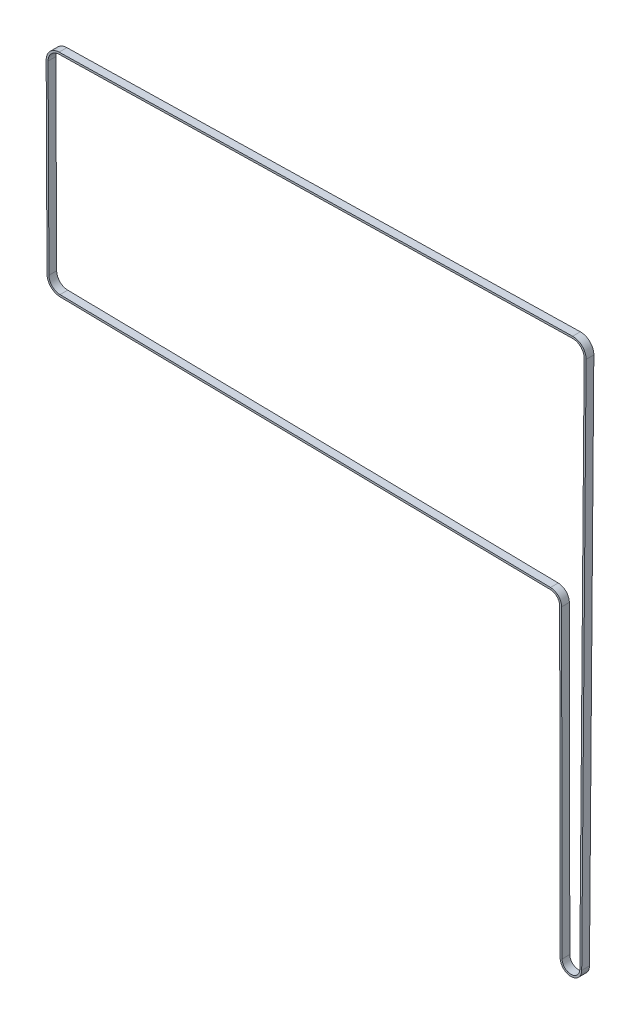
ISO-10303-21;
HEADER;
FILE_DESCRIPTION(('STEP AP214'),'2;1');
FILE_NAME('part.step','',(''),(''),'','','');
FILE_SCHEMA(('AUTOMOTIVE_DESIGN { 1 0 10303 214 1 1 1 1 }'));
ENDSEC;
DATA;
#1=APPLICATION_CONTEXT('core data for automotive mechanical design processes');
#2=APPLICATION_PROTOCOL_DEFINITION('international standard','automotive_design',2000,#1);
#3=PRODUCT_CONTEXT('',#1,'mechanical');
#4=PRODUCT('Part','Part','',(#3));
#5=PRODUCT_RELATED_PRODUCT_CATEGORY('part','',(#4));
#6=PRODUCT_DEFINITION_FORMATION('','',#4);
#7=PRODUCT_DEFINITION_CONTEXT('part definition',#1,'design');
#8=PRODUCT_DEFINITION('design','',#6,#7);
#9=PRODUCT_DEFINITION_SHAPE('','',#8);
#10=(LENGTH_UNIT() NAMED_UNIT(*) SI_UNIT(.MILLI.,.METRE.));
#11=(NAMED_UNIT(*) PLANE_ANGLE_UNIT() SI_UNIT($,.RADIAN.));
#12=(NAMED_UNIT(*) SI_UNIT($,.STERADIAN.) SOLID_ANGLE_UNIT());
#13=UNCERTAINTY_MEASURE_WITH_UNIT(LENGTH_MEASURE(1.E-05),#10,'distance_accuracy_value','');
#14=(GEOMETRIC_REPRESENTATION_CONTEXT(3) GLOBAL_UNCERTAINTY_ASSIGNED_CONTEXT((#13)) GLOBAL_UNIT_ASSIGNED_CONTEXT((#10,
#11,#12)) REPRESENTATION_CONTEXT('',''));
#15=CARTESIAN_POINT('',(0.,0.,0.));
#16=DIRECTION('',(0.,0.,1.));
#17=DIRECTION('',(1.,0.,0.));
#18=AXIS2_PLACEMENT_3D('',#15,#16,#17);
#19=CARTESIAN_POINT('',(4.9960036108132E-13,-1.19348975147204E-12,6.));
#20=DIRECTION('',(0.,0.,1.));
#21=DIRECTION('',(1.,0.,0.));
#22=AXIS2_PLACEMENT_3D('',#19,#20,#21);
#23=PLANE('',#22);
#24=CARTESIAN_POINT('',(4.9960036108132E-13,-1.19348975147204E-12,6.));
#25=DIRECTION('',(0.,0.,1.));
#26=DIRECTION('',(1.,0.,0.));
#27=AXIS2_PLACEMENT_3D('',#24,#25,#26);
#28=CIRCLE('',#27,8.35869999999982);
#29=CARTESIAN_POINT('',(-8.35868853350012,-0.0138452129764266,6.));
#30=VERTEX_POINT('',#29);
#31=CARTESIAN_POINT('',(8.3584168340227,-0.0688020256344854,6.));
#32=VERTEX_POINT('',#31);
#33=EDGE_CURVE('E309',#30,#32,#28,.T.);
#34=ORIENTED_EDGE('',*,*,#33,.T.);
#35=DIRECTION('',(0.00823118734173087,0.999966123203654,0.));
#36=VECTOR('',#35,1.);
#37=CARTESIAN_POINT('',(8.3584168340227,-0.0688020256344854,6.));
#38=LINE('',#37,#36);
#39=CARTESIAN_POINT('',(11.7496527628367,411.915630331115,6.));
#40=VERTEX_POINT('',#39);
#41=EDGE_CURVE('E312',#32,#40,#38,.T.);
#42=ORIENTED_EDGE('',*,*,#41,.T.);
#43=CARTESIAN_POINT('',(1.49999999999922,412.000000001368,6.));
#44=DIRECTION('',(0.,0.,1.));
#45=DIRECTION('',(1.,0.,0.));
#46=AXIS2_PLACEMENT_3D('',#43,#44,#45);
#47=CIRCLE('',#46,10.25);
#48=CARTESIAN_POINT('',(1.28663843958557,422.247779119037,6.));
#49=VERTEX_POINT('',#48);
#50=EDGE_CURVE('E315',#40,#49,#47,.T.);
#51=ORIENTED_EDGE('',*,*,#50,.T.);
#52=DIRECTION('',(-0.999783328553097,-0.0208157619915759,0.));
#53=VECTOR('',#52,1.);
#54=CARTESIAN_POINT('',(1.28663843958557,422.247779119037,6.));
#55=LINE('',#54,#53);
#56=CARTESIAN_POINT('',(-396.86057052667,413.958245474336,6.));
#57=VERTEX_POINT('',#56);
#58=EDGE_CURVE('E317',#49,#57,#55,.T.);
#59=ORIENTED_EDGE('',*,*,#58,.T.);
#60=CARTESIAN_POINT('',(-396.647208966257,403.710466356667,6.));
#61=DIRECTION('',(0.,0.,1.));
#62=DIRECTION('',(1.,0.,0.));
#63=AXIS2_PLACEMENT_3D('',#60,#61,#62);
#64=CIRCLE('',#63,10.25);
#65=CARTESIAN_POINT('',(-406.897104697001,403.664233155694,6.));
#66=VERTEX_POINT('',#65);
#67=EDGE_CURVE('E319',#57,#66,#64,.T.);
#68=ORIENTED_EDGE('',*,*,#67,.T.);
#69=DIRECTION('',(0.00451055619251263,-0.999989827389676,0.));
#70=VECTOR('',#69,1.);
#71=CARTESIAN_POINT('',(-406.897104697001,403.664233155694,6.));
#72=LINE('',#71,#70);
#73=CARTESIAN_POINT('',(-406.249895730942,260.178074324828,6.));
#74=VERTEX_POINT('',#73);
#75=EDGE_CURVE('E321',#66,#74,#72,.T.);
#76=ORIENTED_EDGE('',*,*,#75,.T.);
#77=CARTESIAN_POINT('',(-396.000000000198,260.224307525802,6.));
#78=DIRECTION('',(0.,0.,1.));
#79=DIRECTION('',(1.,0.,0.));
#80=AXIS2_PLACEMENT_3D('',#77,#78,#79);
#81=CIRCLE('',#80,10.25);
#82=CARTESIAN_POINT('',(-396.175234336065,249.975805541241,6.));
#83=VERTEX_POINT('',#82);
#84=EDGE_CURVE('E323',#74,#83,#81,.T.);
#85=ORIENTED_EDGE('',*,*,#84,.T.);
#86=DIRECTION('',(0.999853852152209,-0.0170960327675551,0.));
#87=VECTOR('',#86,1.);
#88=CARTESIAN_POINT('',(-396.175234336065,249.975805541241,6.));
#89=LINE('',#88,#87);
#90=CARTESIAN_POINT('',(-15.8760537626279,243.473247953887,6.));
#91=VERTEX_POINT('',#90);
#92=EDGE_CURVE('E325',#83,#91,#89,.T.);
#93=ORIENTED_EDGE('',*,*,#92,.T.);
#94=CARTESIAN_POINT('',(-16.0000000001927,236.224307525783,6.));
#95=DIRECTION('',(0.,0.,1.));
#96=DIRECTION('',(1.,0.,0.));
#97=AXIS2_PLACEMENT_3D('',#94,#95,#96);
#98=CIRCLE('',#97,7.25);
#99=CARTESIAN_POINT('',(-8.75000994577271,236.236316306344,6.));
#100=VERTEX_POINT('',#99);
#101=EDGE_CURVE('E327',#91,#100,#98,.F.);
#102=ORIENTED_EDGE('',*,*,#101,.T.);
#103=DIRECTION('',(0.00165638352558019,-0.999998628195867,0.));
#104=VECTOR('',#103,1.);
#105=CARTESIAN_POINT('',(-8.75000994577271,236.236316306344,6.));
#106=LINE('',#105,#104);
#107=EDGE_CURVE('E329',#100,#30,#106,.T.);
#108=ORIENTED_EDGE('',*,*,#107,.T.);
#109=EDGE_LOOP('',(#34,#42,#51,#59,#68,#76,#85,#93,#102,#108));
#110=FACE_BOUND('',#109,.T.);
#111=DIRECTION('',(0.00823118734173087,0.999966123203654,0.));
#112=VECTOR('',#111,1.);
#113=CARTESIAN_POINT('',(6.85846764921722,-0.0564552446218891,6.));
#114=LINE('',#113,#112);
#115=CARTESIAN_POINT('',(6.85846764921722,-0.0564552446218891,6.));
#116=VERTEX_POINT('',#115);
#117=CARTESIAN_POINT('',(10.2497035780312,411.927977112128,6.));
#118=VERTEX_POINT('',#117);
#119=EDGE_CURVE('E238',#116,#118,#114,.T.);
#120=ORIENTED_EDGE('',*,*,#119,.F.);
#121=CARTESIAN_POINT('',(4.9960036108132E-13,-1.19348975147204E-12,6.));
#122=DIRECTION('',(0.,0.,1.));
#123=DIRECTION('',(1.,0.,0.));
#124=AXIS2_PLACEMENT_3D('',#121,#122,#123);
#125=CIRCLE('',#124,6.85869999999982);
#126=CARTESIAN_POINT('',(-6.85869059120632,-0.0113606376880571,6.));
#127=VERTEX_POINT('',#126);
#128=EDGE_CURVE('E230',#127,#116,#125,.T.);
#129=ORIENTED_EDGE('',*,*,#128,.F.);
#130=DIRECTION('',(0.00165638352558019,-0.999998628195867,0.));
#131=VECTOR('',#130,1.);
#132=CARTESIAN_POINT('',(-7.25001200347891,236.238800881632,6.));
#133=LINE('',#132,#131);
#134=CARTESIAN_POINT('',(-7.25001200347891,236.238800881632,6.));
#135=VERTEX_POINT('',#134);
#136=EDGE_CURVE('E267',#135,#127,#133,.T.);
#137=ORIENTED_EDGE('',*,*,#136,.F.);
#138=CARTESIAN_POINT('',(-16.0000000001927,236.224307525783,6.));
#139=DIRECTION('',(0.,0.,-1.));
#140=DIRECTION('',(-1.,0.,0.));
#141=AXIS2_PLACEMENT_3D('',#138,#139,#140);
#142=CIRCLE('',#141,8.75);
#143=CARTESIAN_POINT('',(-15.8504097134766,244.973028732115,6.));
#144=VERTEX_POINT('',#143);
#145=EDGE_CURVE('E265',#144,#135,#142,.T.);
#146=ORIENTED_EDGE('',*,*,#145,.F.);
#147=DIRECTION('',(0.999853852152209,-0.0170960327675551,0.));
#148=VECTOR('',#147,1.);
#149=CARTESIAN_POINT('',(-396.149590286914,251.47558631947,6.));
#150=LINE('',#149,#148);
#151=CARTESIAN_POINT('',(-396.149590286914,251.47558631947,6.));
#152=VERTEX_POINT('',#151);
#153=EDGE_CURVE('E263',#152,#144,#150,.T.);
#154=ORIENTED_EDGE('',*,*,#153,.F.);
#155=CARTESIAN_POINT('',(-396.000000000198,260.224307525802,6.));
#156=DIRECTION('',(0.,0.,1.));
#157=DIRECTION('',(1.,0.,0.));
#158=AXIS2_PLACEMENT_3D('',#155,#156,#157);
#159=CIRCLE('',#158,8.75000000000001);
#160=CARTESIAN_POINT('',(-404.749910989857,260.184840159117,6.));
#161=VERTEX_POINT('',#160);
#162=EDGE_CURVE('E261',#161,#152,#159,.T.);
#163=ORIENTED_EDGE('',*,*,#162,.F.);
#164=DIRECTION('',(0.00451055619251263,-0.999989827389676,0.));
#165=VECTOR('',#164,1.);
#166=CARTESIAN_POINT('',(-405.397119955916,403.670998989983,6.));
#167=LINE('',#166,#165);
#168=CARTESIAN_POINT('',(-405.397119955916,403.670998989983,6.));
#169=VERTEX_POINT('',#168);
#170=EDGE_CURVE('E259',#169,#161,#167,.T.);
#171=ORIENTED_EDGE('',*,*,#170,.F.);
#172=CARTESIAN_POINT('',(-396.647208966257,403.710466356667,6.));
#173=DIRECTION('',(0.,0.,1.));
#174=DIRECTION('',(1.,0.,0.));
#175=AXIS2_PLACEMENT_3D('',#172,#173,#174);
#176=CIRCLE('',#175,8.75000000000001);
#177=CARTESIAN_POINT('',(-396.829346883683,412.458570481507,6.));
#178=VERTEX_POINT('',#177);
#179=EDGE_CURVE('E257',#178,#169,#176,.T.);
#180=ORIENTED_EDGE('',*,*,#179,.F.);
#181=DIRECTION('',(-0.999783328553097,-0.0208157619915759,0.));
#182=VECTOR('',#181,1.);
#183=CARTESIAN_POINT('',(1.31786208257294,420.748104126207,6.));
#184=LINE('',#183,#182);
#185=CARTESIAN_POINT('',(1.31786208257294,420.748104126207,6.));
#186=VERTEX_POINT('',#185);
#187=EDGE_CURVE('E253',#186,#178,#184,.T.);
#188=ORIENTED_EDGE('',*,*,#187,.F.);
#189=CARTESIAN_POINT('',(1.49999999999922,412.000000001368,6.));
#190=DIRECTION('',(0.,0.,1.));
#191=DIRECTION('',(1.,0.,0.));
#192=AXIS2_PLACEMENT_3D('',#189,#190,#191);
#193=CIRCLE('',#192,8.75000000000001);
#194=EDGE_CURVE('E251',#118,#186,#193,.T.);
#195=ORIENTED_EDGE('',*,*,#194,.F.);
#196=EDGE_LOOP('',(#120,#129,#137,#146,#154,#163,#171,#180,#188,#195));
#197=FACE_BOUND('',#196,.T.);
#198=ADVANCED_FACE('F93',(#110,#197),#23,.T.);
#199=CARTESIAN_POINT('',(4.9960036108132E-13,-1.19348975147204E-12,0.));
#200=DIRECTION('',(0.,0.,1.));
#201=DIRECTION('',(1.,0.,0.));
#202=AXIS2_PLACEMENT_3D('',#199,#200,#201);
#203=PLANE('',#202);
#204=CARTESIAN_POINT('',(4.9960036108132E-13,-1.19348975147204E-12,0.));
#205=DIRECTION('',(0.,0.,1.));
#206=DIRECTION('',(1.,0.,0.));
#207=AXIS2_PLACEMENT_3D('',#204,#205,#206);
#208=CIRCLE('',#207,8.35869999999982);
#209=CARTESIAN_POINT('',(-8.35868853350012,-0.0138452129764266,0.));
#210=VERTEX_POINT('',#209);
#211=CARTESIAN_POINT('',(8.3584168340227,-0.0688020256344854,0.));
#212=VERTEX_POINT('',#211);
#213=EDGE_CURVE('E246',#210,#212,#208,.T.);
#214=ORIENTED_EDGE('',*,*,#213,.F.);
#215=DIRECTION('',(0.00165638352558019,-0.999998628195867,0.));
#216=VECTOR('',#215,1.);
#217=CARTESIAN_POINT('',(-8.75000994577271,236.236316306344,0.));
#218=LINE('',#217,#216);
#219=CARTESIAN_POINT('',(-8.75000994577271,236.236316306344,0.));
#220=VERTEX_POINT('',#219);
#221=EDGE_CURVE('E313',#220,#210,#218,.T.);
#222=ORIENTED_EDGE('',*,*,#221,.F.);
#223=CARTESIAN_POINT('',(-16.0000000001927,236.224307525783,0.));
#224=DIRECTION('',(0.,0.,1.));
#225=DIRECTION('',(1.,0.,0.));
#226=AXIS2_PLACEMENT_3D('',#223,#224,#225);
#227=CIRCLE('',#226,7.25);
#228=CARTESIAN_POINT('',(-15.8760537626279,243.473247953887,0.));
#229=VERTEX_POINT('',#228);
#230=EDGE_CURVE('E348',#229,#220,#227,.F.);
#231=ORIENTED_EDGE('',*,*,#230,.F.);
#232=DIRECTION('',(0.999853852152209,-0.0170960327675551,0.));
#233=VECTOR('',#232,1.);
#234=CARTESIAN_POINT('',(-396.175234336065,249.975805541241,0.));
#235=LINE('',#234,#233);
#236=CARTESIAN_POINT('',(-396.175234336065,249.975805541241,0.));
#237=VERTEX_POINT('',#236);
#238=EDGE_CURVE('E346',#237,#229,#235,.T.);
#239=ORIENTED_EDGE('',*,*,#238,.F.);
#240=CARTESIAN_POINT('',(-396.000000000198,260.224307525802,0.));
#241=DIRECTION('',(0.,0.,1.));
#242=DIRECTION('',(1.,0.,0.));
#243=AXIS2_PLACEMENT_3D('',#240,#241,#242);
#244=CIRCLE('',#243,10.25);
#245=CARTESIAN_POINT('',(-406.249895730942,260.178074324828,0.));
#246=VERTEX_POINT('',#245);
#247=EDGE_CURVE('E344',#246,#237,#244,.T.);
#248=ORIENTED_EDGE('',*,*,#247,.F.);
#249=DIRECTION('',(0.00451055619251263,-0.999989827389676,0.));
#250=VECTOR('',#249,1.);
#251=CARTESIAN_POINT('',(-406.897104697001,403.664233155694,0.));
#252=LINE('',#251,#250);
#253=CARTESIAN_POINT('',(-406.897104697001,403.664233155694,0.));
#254=VERTEX_POINT('',#253);
#255=EDGE_CURVE('E342',#254,#246,#252,.T.);
#256=ORIENTED_EDGE('',*,*,#255,.F.);
#257=CARTESIAN_POINT('',(-396.647208966257,403.710466356667,0.));
#258=DIRECTION('',(0.,0.,1.));
#259=DIRECTION('',(1.,0.,0.));
#260=AXIS2_PLACEMENT_3D('',#257,#258,#259);
#261=CIRCLE('',#260,10.25);
#262=CARTESIAN_POINT('',(-396.86057052667,413.958245474336,0.));
#263=VERTEX_POINT('',#262);
#264=EDGE_CURVE('E340',#263,#254,#261,.T.);
#265=ORIENTED_EDGE('',*,*,#264,.F.);
#266=DIRECTION('',(-0.999783328553097,-0.0208157619915759,0.));
#267=VECTOR('',#266,1.);
#268=CARTESIAN_POINT('',(1.28663843958557,422.247779119037,0.));
#269=LINE('',#268,#267);
#270=CARTESIAN_POINT('',(1.28663843958557,422.247779119037,0.));
#271=VERTEX_POINT('',#270);
#272=EDGE_CURVE('E338',#271,#263,#269,.T.);
#273=ORIENTED_EDGE('',*,*,#272,.F.);
#274=CARTESIAN_POINT('',(1.49999999999922,412.000000001368,0.));
#275=DIRECTION('',(0.,0.,1.));
#276=DIRECTION('',(1.,0.,0.));
#277=AXIS2_PLACEMENT_3D('',#274,#275,#276);
#278=CIRCLE('',#277,10.25);
#279=CARTESIAN_POINT('',(11.7496527628367,411.915630331115,0.));
#280=VERTEX_POINT('',#279);
#281=EDGE_CURVE('E336',#280,#271,#278,.T.);
#282=ORIENTED_EDGE('',*,*,#281,.F.);
#283=DIRECTION('',(0.00823118734173087,0.999966123203654,0.));
#284=VECTOR('',#283,1.);
#285=CARTESIAN_POINT('',(8.3584168340227,-0.0688020256344854,0.));
#286=LINE('',#285,#284);
#287=EDGE_CURVE('E334',#212,#280,#286,.T.);
#288=ORIENTED_EDGE('',*,*,#287,.F.);
#289=EDGE_LOOP('',(#214,#222,#231,#239,#248,#256,#265,#273,#282,#288));
#290=FACE_BOUND('',#289,.T.);
#291=CARTESIAN_POINT('',(4.9960036108132E-13,-1.19348975147204E-12,0.));
#292=DIRECTION('',(0.,0.,1.));
#293=DIRECTION('',(1.,0.,0.));
#294=AXIS2_PLACEMENT_3D('',#291,#292,#293);
#295=CIRCLE('',#294,6.85869999999982);
#296=CARTESIAN_POINT('',(-6.85869059120631,-0.0113606376880571,0.));
#297=VERTEX_POINT('',#296);
#298=CARTESIAN_POINT('',(6.85846764921722,-0.0564552446218891,0.));
#299=VERTEX_POINT('',#298);
#300=EDGE_CURVE('E116',#297,#299,#295,.T.);
#301=ORIENTED_EDGE('',*,*,#300,.T.);
#302=DIRECTION('',(0.00823118734173087,0.999966123203654,0.));
#303=VECTOR('',#302,1.);
#304=CARTESIAN_POINT('',(6.85846764921722,-0.0564552446218891,0.));
#305=LINE('',#304,#303);
#306=CARTESIAN_POINT('',(10.2497035780312,411.927977112128,0.));
#307=VERTEX_POINT('',#306);
#308=EDGE_CURVE('E245',#299,#307,#305,.T.);
#309=ORIENTED_EDGE('',*,*,#308,.T.);
#310=CARTESIAN_POINT('',(1.49999999999922,412.000000001368,0.));
#311=DIRECTION('',(0.,0.,1.));
#312=DIRECTION('',(1.,0.,0.));
#313=AXIS2_PLACEMENT_3D('',#310,#311,#312);
#314=CIRCLE('',#313,8.75000000000001);
#315=CARTESIAN_POINT('',(1.31786208257294,420.748104126207,0.));
#316=VERTEX_POINT('',#315);
#317=EDGE_CURVE('E271',#307,#316,#314,.T.);
#318=ORIENTED_EDGE('',*,*,#317,.T.);
#319=DIRECTION('',(-0.999783328553097,-0.0208157619915759,0.));
#320=VECTOR('',#319,1.);
#321=CARTESIAN_POINT('',(1.31786208257294,420.748104126207,0.));
#322=LINE('',#321,#320);
#323=CARTESIAN_POINT('',(-396.829346883683,412.458570481507,0.));
#324=VERTEX_POINT('',#323);
#325=EDGE_CURVE('E274',#316,#324,#322,.T.);
#326=ORIENTED_EDGE('',*,*,#325,.T.);
#327=CARTESIAN_POINT('',(-396.647208966257,403.710466356667,0.));
#328=DIRECTION('',(0.,0.,1.));
#329=DIRECTION('',(1.,0.,0.));
#330=AXIS2_PLACEMENT_3D('',#327,#328,#329);
#331=CIRCLE('',#330,8.75000000000001);
#332=CARTESIAN_POINT('',(-405.397119955916,403.670998989983,0.));
#333=VERTEX_POINT('',#332);
#334=EDGE_CURVE('E277',#324,#333,#331,.T.);
#335=ORIENTED_EDGE('',*,*,#334,.T.);
#336=DIRECTION('',(0.00451055619251263,-0.999989827389676,0.));
#337=VECTOR('',#336,1.);
#338=CARTESIAN_POINT('',(-405.397119955916,403.670998989983,0.));
#339=LINE('',#338,#337);
#340=CARTESIAN_POINT('',(-404.749910989857,260.184840159117,0.));
#341=VERTEX_POINT('',#340);
#342=EDGE_CURVE('E280',#333,#341,#339,.T.);
#343=ORIENTED_EDGE('',*,*,#342,.T.);
#344=CARTESIAN_POINT('',(-396.000000000198,260.224307525802,0.));
#345=DIRECTION('',(0.,0.,1.));
#346=DIRECTION('',(1.,0.,0.));
#347=AXIS2_PLACEMENT_3D('',#344,#345,#346);
#348=CIRCLE('',#347,8.75000000000001);
#349=CARTESIAN_POINT('',(-396.149590286914,251.47558631947,0.));
#350=VERTEX_POINT('',#349);
#351=EDGE_CURVE('E283',#341,#350,#348,.T.);
#352=ORIENTED_EDGE('',*,*,#351,.T.);
#353=DIRECTION('',(0.999853852152209,-0.0170960327675551,0.));
#354=VECTOR('',#353,1.);
#355=CARTESIAN_POINT('',(-396.149590286914,251.47558631947,0.));
#356=LINE('',#355,#354);
#357=CARTESIAN_POINT('',(-15.8504097134766,244.973028732115,0.));
#358=VERTEX_POINT('',#357);
#359=EDGE_CURVE('E286',#350,#358,#356,.T.);
#360=ORIENTED_EDGE('',*,*,#359,.T.);
#361=CARTESIAN_POINT('',(-16.0000000001927,236.224307525783,0.));
#362=DIRECTION('',(0.,0.,-1.));
#363=DIRECTION('',(-1.,0.,0.));
#364=AXIS2_PLACEMENT_3D('',#361,#362,#363);
#365=CIRCLE('',#364,8.75);
#366=CARTESIAN_POINT('',(-7.25001200347891,236.238800881632,0.));
#367=VERTEX_POINT('',#366);
#368=EDGE_CURVE('E289',#358,#367,#365,.T.);
#369=ORIENTED_EDGE('',*,*,#368,.T.);
#370=DIRECTION('',(0.00165638352558019,-0.999998628195867,0.));
#371=VECTOR('',#370,1.);
#372=CARTESIAN_POINT('',(-7.25001200347891,236.238800881632,0.));
#373=LINE('',#372,#371);
#374=EDGE_CURVE('E239',#367,#297,#373,.T.);
#375=ORIENTED_EDGE('',*,*,#374,.T.);
#376=EDGE_LOOP('',(#301,#309,#318,#326,#335,#343,#352,#360,#369,#375));
#377=FACE_BOUND('',#376,.T.);
#378=ADVANCED_FACE('F384',(#290,#377),#203,.F.);
#379=CARTESIAN_POINT('',(4.9960036108132E-13,-1.19348975147204E-12,6.));
#380=DIRECTION('',(0.,0.,-1.));
#381=DIRECTION('',(-1.,0.,0.));
#382=AXIS2_PLACEMENT_3D('',#379,#380,#381);
#383=CYLINDRICAL_SURFACE('',#382,8.35869999999982);
#384=ORIENTED_EDGE('',*,*,#213,.T.);
#385=DIRECTION('',(0.,0.,-1.));
#386=VECTOR('',#385,1.);
#387=CARTESIAN_POINT('',(8.3584168340227,-0.0688020256344854,6.));
#388=LINE('',#387,#386);
#389=EDGE_CURVE('E12',#32,#212,#388,.T.);
#390=ORIENTED_EDGE('',*,*,#389,.F.);
#391=ORIENTED_EDGE('',*,*,#33,.F.);
#392=DIRECTION('',(0.,0.,-1.));
#393=VECTOR('',#392,1.);
#394=CARTESIAN_POINT('',(-8.35868853350012,-0.0138452129764266,6.));
#395=LINE('',#394,#393);
#396=EDGE_CURVE('E331',#30,#210,#395,.T.);
#397=ORIENTED_EDGE('',*,*,#396,.T.);
#398=EDGE_LOOP('',(#384,#390,#391,#397));
#399=FACE_BOUND('',#398,.T.);
#400=ADVANCED_FACE('F95',(#399),#383,.T.);
#401=CARTESIAN_POINT('',(8.3584168340227,-0.0688020256344854,6.));
#402=DIRECTION('',(-0.999966123203654,0.00823118734173087,0.));
#403=DIRECTION('',(-0.00823118734173087,-0.999966123203654,0.));
#404=AXIS2_PLACEMENT_3D('',#401,#402,#403);
#405=PLANE('',#404);
#406=ORIENTED_EDGE('',*,*,#287,.T.);
#407=DIRECTION('',(0.,0.,-1.));
#408=VECTOR('',#407,1.);
#409=CARTESIAN_POINT('',(11.7496527628367,411.915630331115,6.));
#410=LINE('',#409,#408);
#411=EDGE_CURVE('E101',#40,#280,#410,.T.);
#412=ORIENTED_EDGE('',*,*,#411,.F.);
#413=ORIENTED_EDGE('',*,*,#41,.F.);
#414=ORIENTED_EDGE('',*,*,#389,.T.);
#415=EDGE_LOOP('',(#406,#412,#413,#414));
#416=FACE_BOUND('',#415,.T.);
#417=ADVANCED_FACE('F401',(#416),#405,.F.);
#418=CARTESIAN_POINT('',(1.49999999999922,412.000000001368,6.));
#419=DIRECTION('',(0.,0.,-1.));
#420=DIRECTION('',(-1.,0.,0.));
#421=AXIS2_PLACEMENT_3D('',#418,#419,#420);
#422=CYLINDRICAL_SURFACE('',#421,10.25);
#423=ORIENTED_EDGE('',*,*,#281,.T.);
#424=DIRECTION('',(0.,0.,-1.));
#425=VECTOR('',#424,1.);
#426=CARTESIAN_POINT('',(1.28663843958557,422.247779119037,6.));
#427=LINE('',#426,#425);
#428=EDGE_CURVE('E371',#49,#271,#427,.T.);
#429=ORIENTED_EDGE('',*,*,#428,.F.);
#430=ORIENTED_EDGE('',*,*,#50,.F.);
#431=ORIENTED_EDGE('',*,*,#411,.T.);
#432=EDGE_LOOP('',(#423,#429,#430,#431));
#433=FACE_BOUND('',#432,.T.);
#434=ADVANCED_FACE('F378',(#433),#422,.T.);
#435=CARTESIAN_POINT('',(1.28663843958557,422.247779119037,6.));
#436=DIRECTION('',(0.0208157619915759,-0.999783328553097,0.));
#437=DIRECTION('',(0.999783328553097,0.0208157619915759,0.));
#438=AXIS2_PLACEMENT_3D('',#435,#436,#437);
#439=PLANE('',#438);
#440=ORIENTED_EDGE('',*,*,#272,.T.);
#441=DIRECTION('',(0.,0.,-1.));
#442=VECTOR('',#441,1.);
#443=CARTESIAN_POINT('',(-396.86057052667,413.958245474336,6.));
#444=LINE('',#443,#442);
#445=EDGE_CURVE('E368',#57,#263,#444,.T.);
#446=ORIENTED_EDGE('',*,*,#445,.F.);
#447=ORIENTED_EDGE('',*,*,#58,.F.);
#448=ORIENTED_EDGE('',*,*,#428,.T.);
#449=EDGE_LOOP('',(#440,#446,#447,#448));
#450=FACE_BOUND('',#449,.T.);
#451=ADVANCED_FACE('F390',(#450),#439,.F.);
#452=CARTESIAN_POINT('',(-396.647208966257,403.710466356667,6.));
#453=DIRECTION('',(0.,0.,-1.));
#454=DIRECTION('',(-1.,0.,0.));
#455=AXIS2_PLACEMENT_3D('',#452,#453,#454);
#456=CYLINDRICAL_SURFACE('',#455,10.25);
#457=ORIENTED_EDGE('',*,*,#264,.T.);
#458=DIRECTION('',(0.,0.,-1.));
#459=VECTOR('',#458,1.);
#460=CARTESIAN_POINT('',(-406.897104697001,403.664233155694,6.));
#461=LINE('',#460,#459);
#462=EDGE_CURVE('E365',#66,#254,#461,.T.);
#463=ORIENTED_EDGE('',*,*,#462,.F.);
#464=ORIENTED_EDGE('',*,*,#67,.F.);
#465=ORIENTED_EDGE('',*,*,#445,.T.);
#466=EDGE_LOOP('',(#457,#463,#464,#465));
#467=FACE_BOUND('',#466,.T.);
#468=ADVANCED_FACE('F394',(#467),#456,.T.);
#469=CARTESIAN_POINT('',(-406.897104697001,403.664233155694,6.));
#470=DIRECTION('',(0.999989827389676,0.00451055619251263,0.));
#471=DIRECTION('',(-0.00451055619251263,0.999989827389676,0.));
#472=AXIS2_PLACEMENT_3D('',#469,#470,#471);
#473=PLANE('',#472);
#474=ORIENTED_EDGE('',*,*,#255,.T.);
#475=DIRECTION('',(0.,0.,-1.));
#476=VECTOR('',#475,1.);
#477=CARTESIAN_POINT('',(-406.249895730942,260.178074324828,6.));
#478=LINE('',#477,#476);
#479=EDGE_CURVE('E362',#74,#246,#478,.T.);
#480=ORIENTED_EDGE('',*,*,#479,.F.);
#481=ORIENTED_EDGE('',*,*,#75,.F.);
#482=ORIENTED_EDGE('',*,*,#462,.T.);
#483=EDGE_LOOP('',(#474,#480,#481,#482));
#484=FACE_BOUND('',#483,.T.);
#485=ADVANCED_FACE('F424',(#484),#473,.F.);
#486=CARTESIAN_POINT('',(-396.000000000198,260.224307525802,6.));
#487=DIRECTION('',(0.,0.,-1.));
#488=DIRECTION('',(-1.,0.,0.));
#489=AXIS2_PLACEMENT_3D('',#486,#487,#488);
#490=CYLINDRICAL_SURFACE('',#489,10.25);
#491=ORIENTED_EDGE('',*,*,#247,.T.);
#492=DIRECTION('',(0.,0.,-1.));
#493=VECTOR('',#492,1.);
#494=CARTESIAN_POINT('',(-396.175234336065,249.975805541241,6.));
#495=LINE('',#494,#493);
#496=EDGE_CURVE('E359',#83,#237,#495,.T.);
#497=ORIENTED_EDGE('',*,*,#496,.F.);
#498=ORIENTED_EDGE('',*,*,#84,.F.);
#499=ORIENTED_EDGE('',*,*,#479,.T.);
#500=EDGE_LOOP('',(#491,#497,#498,#499));
#501=FACE_BOUND('',#500,.T.);
#502=ADVANCED_FACE('F421',(#501),#490,.T.);
#503=CARTESIAN_POINT('',(-396.175234336065,249.975805541241,6.));
#504=DIRECTION('',(0.0170960327675551,0.999853852152209,0.));
#505=DIRECTION('',(-0.999853852152209,0.0170960327675551,0.));
#506=AXIS2_PLACEMENT_3D('',#503,#504,#505);
#507=PLANE('',#506);
#508=ORIENTED_EDGE('',*,*,#238,.T.);
#509=DIRECTION('',(0.,0.,-1.));
#510=VECTOR('',#509,1.);
#511=CARTESIAN_POINT('',(-15.8760537626279,243.473247953887,6.));
#512=LINE('',#511,#510);
#513=EDGE_CURVE('E356',#91,#229,#512,.T.);
#514=ORIENTED_EDGE('',*,*,#513,.F.);
#515=ORIENTED_EDGE('',*,*,#92,.F.);
#516=ORIENTED_EDGE('',*,*,#496,.T.);
#517=EDGE_LOOP('',(#508,#514,#515,#516));
#518=FACE_BOUND('',#517,.T.);
#519=ADVANCED_FACE('F417',(#518),#507,.F.);
#520=CARTESIAN_POINT('',(-16.0000000001927,236.224307525783,6.));
#521=DIRECTION('',(0.,0.,-1.));
#522=DIRECTION('',(-1.,0.,0.));
#523=AXIS2_PLACEMENT_3D('',#520,#521,#522);
#524=CYLINDRICAL_SURFACE('',#523,7.25);
#525=ORIENTED_EDGE('',*,*,#230,.T.);
#526=DIRECTION('',(0.,0.,-1.));
#527=VECTOR('',#526,1.);
#528=CARTESIAN_POINT('',(-8.75000994577271,236.236316306344,6.));
#529=LINE('',#528,#527);
#530=EDGE_CURVE('E353',#100,#220,#529,.T.);
#531=ORIENTED_EDGE('',*,*,#530,.F.);
#532=ORIENTED_EDGE('',*,*,#101,.F.);
#533=ORIENTED_EDGE('',*,*,#513,.T.);
#534=EDGE_LOOP('',(#525,#531,#532,#533));
#535=FACE_BOUND('',#534,.T.);
#536=ADVANCED_FACE('F413',(#535),#524,.F.);
#537=CARTESIAN_POINT('',(-8.75000994577271,236.236316306344,6.));
#538=DIRECTION('',(0.999998628195867,0.00165638352558019,0.));
#539=DIRECTION('',(-0.00165638352558019,0.999998628195867,0.));
#540=AXIS2_PLACEMENT_3D('',#537,#538,#539);
#541=PLANE('',#540);
#542=ORIENTED_EDGE('',*,*,#221,.T.);
#543=ORIENTED_EDGE('',*,*,#396,.F.);
#544=ORIENTED_EDGE('',*,*,#107,.F.);
#545=ORIENTED_EDGE('',*,*,#530,.T.);
#546=EDGE_LOOP('',(#542,#543,#544,#545));
#547=FACE_BOUND('',#546,.T.);
#548=ADVANCED_FACE('F408',(#547),#541,.F.);
#549=CARTESIAN_POINT('',(4.9960036108132E-13,-1.19348975147204E-12,6.));
#550=DIRECTION('',(0.,0.,-1.));
#551=DIRECTION('',(-1.,0.,0.));
#552=AXIS2_PLACEMENT_3D('',#549,#550,#551);
#553=CYLINDRICAL_SURFACE('',#552,6.85869999999982);
#554=ORIENTED_EDGE('',*,*,#300,.F.);
#555=DIRECTION('',(0.,0.,-1.));
#556=VECTOR('',#555,1.);
#557=CARTESIAN_POINT('',(-6.85869059120632,-0.0113606376880571,6.));
#558=LINE('',#557,#556);
#559=EDGE_CURVE('E234',#127,#297,#558,.T.);
#560=ORIENTED_EDGE('',*,*,#559,.F.);
#561=ORIENTED_EDGE('',*,*,#128,.T.);
#562=DIRECTION('',(0.,0.,-1.));
#563=VECTOR('',#562,1.);
#564=CARTESIAN_POINT('',(6.85846764921722,-0.0564552446218891,6.));
#565=LINE('',#564,#563);
#566=EDGE_CURVE('E233',#116,#299,#565,.T.);
#567=ORIENTED_EDGE('',*,*,#566,.T.);
#568=EDGE_LOOP('',(#554,#560,#561,#567));
#569=FACE_BOUND('',#568,.T.);
#570=ADVANCED_FACE('F232',(#569),#553,.F.);
#571=CARTESIAN_POINT('',(6.85846764921722,-0.0564552446218891,6.));
#572=DIRECTION('',(-0.999966123203654,0.00823118734173087,0.));
#573=DIRECTION('',(-0.00823118734173087,-0.999966123203654,0.));
#574=AXIS2_PLACEMENT_3D('',#571,#572,#573);
#575=PLANE('',#574);
#576=ORIENTED_EDGE('',*,*,#308,.F.);
#577=ORIENTED_EDGE('',*,*,#566,.F.);
#578=ORIENTED_EDGE('',*,*,#119,.T.);
#579=DIRECTION('',(0.,0.,-1.));
#580=VECTOR('',#579,1.);
#581=CARTESIAN_POINT('',(10.2497035780312,411.927977112128,6.));
#582=LINE('',#581,#580);
#583=EDGE_CURVE('E247',#118,#307,#582,.T.);
#584=ORIENTED_EDGE('',*,*,#583,.T.);
#585=EDGE_LOOP('',(#576,#577,#578,#584));
#586=FACE_BOUND('',#585,.T.);
#587=ADVANCED_FACE('F242',(#586),#575,.T.);
#588=CARTESIAN_POINT('',(1.49999999999922,412.000000001368,6.));
#589=DIRECTION('',(0.,0.,-1.));
#590=DIRECTION('',(-1.,0.,0.));
#591=AXIS2_PLACEMENT_3D('',#588,#589,#590);
#592=CYLINDRICAL_SURFACE('',#591,8.75000000000001);
#593=ORIENTED_EDGE('',*,*,#317,.F.);
#594=ORIENTED_EDGE('',*,*,#583,.F.);
#595=ORIENTED_EDGE('',*,*,#194,.T.);
#596=DIRECTION('',(0.,0.,-1.));
#597=VECTOR('',#596,1.);
#598=CARTESIAN_POINT('',(1.31786208257294,420.748104126207,6.));
#599=LINE('',#598,#597);
#600=EDGE_CURVE('E306',#186,#316,#599,.T.);
#601=ORIENTED_EDGE('',*,*,#600,.T.);
#602=EDGE_LOOP('',(#593,#594,#595,#601));
#603=FACE_BOUND('',#602,.T.);
#604=ADVANCED_FACE('F470',(#603),#592,.F.);
#605=CARTESIAN_POINT('',(1.31786208257294,420.748104126207,6.));
#606=DIRECTION('',(0.0208157619915759,-0.999783328553097,0.));
#607=DIRECTION('',(0.999783328553097,0.0208157619915759,0.));
#608=AXIS2_PLACEMENT_3D('',#605,#606,#607);
#609=PLANE('',#608);
#610=ORIENTED_EDGE('',*,*,#325,.F.);
#611=ORIENTED_EDGE('',*,*,#600,.F.);
#612=ORIENTED_EDGE('',*,*,#187,.T.);
#613=DIRECTION('',(0.,0.,-1.));
#614=VECTOR('',#613,1.);
#615=CARTESIAN_POINT('',(-396.829346883683,412.458570481507,6.));
#616=LINE('',#615,#614);
#617=EDGE_CURVE('E304',#178,#324,#616,.T.);
#618=ORIENTED_EDGE('',*,*,#617,.T.);
#619=EDGE_LOOP('',(#610,#611,#612,#618));
#620=FACE_BOUND('',#619,.T.);
#621=ADVANCED_FACE('F476',(#620),#609,.T.);
#622=CARTESIAN_POINT('',(-396.647208966257,403.710466356667,6.));
#623=DIRECTION('',(0.,0.,-1.));
#624=DIRECTION('',(-1.,0.,0.));
#625=AXIS2_PLACEMENT_3D('',#622,#623,#624);
#626=CYLINDRICAL_SURFACE('',#625,8.75000000000001);
#627=ORIENTED_EDGE('',*,*,#334,.F.);
#628=ORIENTED_EDGE('',*,*,#617,.F.);
#629=ORIENTED_EDGE('',*,*,#179,.T.);
#630=DIRECTION('',(0.,0.,-1.));
#631=VECTOR('',#630,1.);
#632=CARTESIAN_POINT('',(-405.397119955916,403.670998989983,6.));
#633=LINE('',#632,#631);
#634=EDGE_CURVE('E302',#169,#333,#633,.T.);
#635=ORIENTED_EDGE('',*,*,#634,.T.);
#636=EDGE_LOOP('',(#627,#628,#629,#635));
#637=FACE_BOUND('',#636,.T.);
#638=ADVANCED_FACE('F484',(#637),#626,.F.);
#639=CARTESIAN_POINT('',(-405.397119955916,403.670998989983,6.));
#640=DIRECTION('',(0.999989827389676,0.00451055619251263,0.));
#641=DIRECTION('',(-0.00451055619251263,0.999989827389676,0.));
#642=AXIS2_PLACEMENT_3D('',#639,#640,#641);
#643=PLANE('',#642);
#644=ORIENTED_EDGE('',*,*,#342,.F.);
#645=ORIENTED_EDGE('',*,*,#634,.F.);
#646=ORIENTED_EDGE('',*,*,#170,.T.);
#647=DIRECTION('',(0.,0.,-1.));
#648=VECTOR('',#647,1.);
#649=CARTESIAN_POINT('',(-404.749910989857,260.184840159117,6.));
#650=LINE('',#649,#648);
#651=EDGE_CURVE('E300',#161,#341,#650,.T.);
#652=ORIENTED_EDGE('',*,*,#651,.T.);
#653=EDGE_LOOP('',(#644,#645,#646,#652));
#654=FACE_BOUND('',#653,.T.);
#655=ADVANCED_FACE('F492',(#654),#643,.T.);
#656=CARTESIAN_POINT('',(-396.000000000198,260.224307525802,6.));
#657=DIRECTION('',(0.,0.,-1.));
#658=DIRECTION('',(-1.,0.,0.));
#659=AXIS2_PLACEMENT_3D('',#656,#657,#658);
#660=CYLINDRICAL_SURFACE('',#659,8.75000000000001);
#661=ORIENTED_EDGE('',*,*,#351,.F.);
#662=ORIENTED_EDGE('',*,*,#651,.F.);
#663=ORIENTED_EDGE('',*,*,#162,.T.);
#664=DIRECTION('',(0.,0.,-1.));
#665=VECTOR('',#664,1.);
#666=CARTESIAN_POINT('',(-396.149590286914,251.47558631947,6.));
#667=LINE('',#666,#665);
#668=EDGE_CURVE('E298',#152,#350,#667,.T.);
#669=ORIENTED_EDGE('',*,*,#668,.T.);
#670=EDGE_LOOP('',(#661,#662,#663,#669));
#671=FACE_BOUND('',#670,.T.);
#672=ADVANCED_FACE('F500',(#671),#660,.F.);
#673=CARTESIAN_POINT('',(-396.149590286914,251.47558631947,6.));
#674=DIRECTION('',(0.0170960327675551,0.999853852152209,0.));
#675=DIRECTION('',(-0.999853852152209,0.0170960327675551,0.));
#676=AXIS2_PLACEMENT_3D('',#673,#674,#675);
#677=PLANE('',#676);
#678=ORIENTED_EDGE('',*,*,#359,.F.);
#679=ORIENTED_EDGE('',*,*,#668,.F.);
#680=ORIENTED_EDGE('',*,*,#153,.T.);
#681=DIRECTION('',(0.,0.,-1.));
#682=VECTOR('',#681,1.);
#683=CARTESIAN_POINT('',(-15.8504097134766,244.973028732115,6.));
#684=LINE('',#683,#682);
#685=EDGE_CURVE('E296',#144,#358,#684,.T.);
#686=ORIENTED_EDGE('',*,*,#685,.T.);
#687=EDGE_LOOP('',(#678,#679,#680,#686));
#688=FACE_BOUND('',#687,.T.);
#689=ADVANCED_FACE('F508',(#688),#677,.T.);
#690=CARTESIAN_POINT('',(-16.0000000001927,236.224307525783,6.));
#691=DIRECTION('',(0.,0.,-1.));
#692=DIRECTION('',(-1.,0.,0.));
#693=AXIS2_PLACEMENT_3D('',#690,#691,#692);
#694=CYLINDRICAL_SURFACE('',#693,8.75);
#695=ORIENTED_EDGE('',*,*,#368,.F.);
#696=ORIENTED_EDGE('',*,*,#685,.F.);
#697=ORIENTED_EDGE('',*,*,#145,.T.);
#698=DIRECTION('',(0.,0.,-1.));
#699=VECTOR('',#698,1.);
#700=CARTESIAN_POINT('',(-7.25001200347891,236.238800881632,6.));
#701=LINE('',#700,#699);
#702=EDGE_CURVE('E108',#135,#367,#701,.T.);
#703=ORIENTED_EDGE('',*,*,#702,.T.);
#704=EDGE_LOOP('',(#695,#696,#697,#703));
#705=FACE_BOUND('',#704,.T.);
#706=ADVANCED_FACE('F516',(#705),#694,.T.);
#707=CARTESIAN_POINT('',(-7.25001200347891,236.238800881632,6.));
#708=DIRECTION('',(0.999998628195867,0.00165638352558019,0.));
#709=DIRECTION('',(-0.00165638352558019,0.999998628195867,0.));
#710=AXIS2_PLACEMENT_3D('',#707,#708,#709);
#711=PLANE('',#710);
#712=ORIENTED_EDGE('',*,*,#374,.F.);
#713=ORIENTED_EDGE('',*,*,#702,.F.);
#714=ORIENTED_EDGE('',*,*,#136,.T.);
#715=ORIENTED_EDGE('',*,*,#559,.T.);
#716=EDGE_LOOP('',(#712,#713,#714,#715));
#717=FACE_BOUND('',#716,.T.);
#718=ADVANCED_FACE('F524',(#717),#711,.T.);
#719=CLOSED_SHELL('',(#198,#378,#400,#417,#434,#451,#468,#485,#502,#519,#536,#548,#570,#587,
#604,#621,#638,#655,#672,#689,#706,#718));
#720=MANIFOLD_SOLID_BREP('B2',#719);
#721=ADVANCED_BREP_SHAPE_REPRESENTATION('',(#18,#720),#14);
#722=SHAPE_DEFINITION_REPRESENTATION(#9,#721);
ENDSEC;
END-ISO-10303-21;
